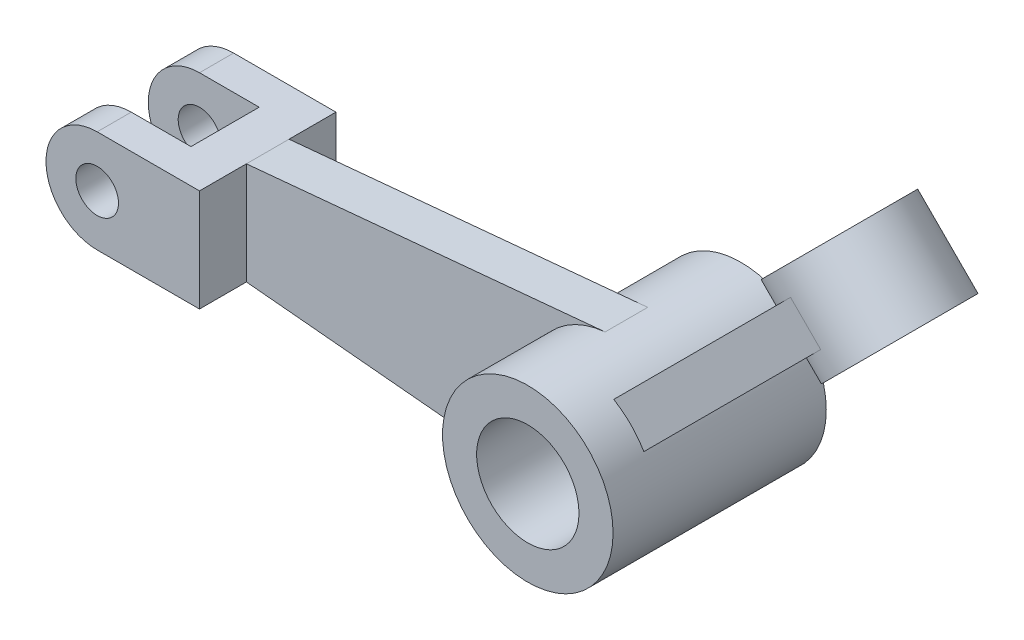
ISO-10303-21;
HEADER;
FILE_DESCRIPTION(('STEP AP214'),'2;1');
FILE_NAME('part.step','',(''),(''),'','','');
FILE_SCHEMA(('AUTOMOTIVE_DESIGN { 1 0 10303 214 1 1 1 1 }'));
ENDSEC;
DATA;
#1=APPLICATION_CONTEXT('core data for automotive mechanical design processes');
#2=APPLICATION_PROTOCOL_DEFINITION('international standard','automotive_design',2000,#1);
#3=PRODUCT_CONTEXT('',#1,'mechanical');
#4=PRODUCT('Part','Part','',(#3));
#5=PRODUCT_RELATED_PRODUCT_CATEGORY('part','',(#4));
#6=PRODUCT_DEFINITION_FORMATION('','',#4);
#7=PRODUCT_DEFINITION_CONTEXT('part definition',#1,'design');
#8=PRODUCT_DEFINITION('design','',#6,#7);
#9=PRODUCT_DEFINITION_SHAPE('','',#8);
#10=(LENGTH_UNIT() NAMED_UNIT(*) SI_UNIT(.MILLI.,.METRE.));
#11=(NAMED_UNIT(*) PLANE_ANGLE_UNIT() SI_UNIT($,.RADIAN.));
#12=(NAMED_UNIT(*) SI_UNIT($,.STERADIAN.) SOLID_ANGLE_UNIT());
#13=UNCERTAINTY_MEASURE_WITH_UNIT(LENGTH_MEASURE(1.E-05),#10,'distance_accuracy_value','');
#14=(GEOMETRIC_REPRESENTATION_CONTEXT(3) GLOBAL_UNCERTAINTY_ASSIGNED_CONTEXT((#13)) GLOBAL_UNIT_ASSIGNED_CONTEXT((#10,
#11,#12)) REPRESENTATION_CONTEXT('',''));
#15=CARTESIAN_POINT('',(0.,0.,0.));
#16=DIRECTION('',(0.,0.,1.));
#17=DIRECTION('',(1.,0.,0.));
#18=AXIS2_PLACEMENT_3D('',#15,#16,#17);
#19=CARTESIAN_POINT('',(-55.,0.,8.));
#20=DIRECTION('',(0.,0.,-1.));
#21=DIRECTION('',(-1.,0.,0.));
#22=AXIS2_PLACEMENT_3D('',#19,#20,#21);
#23=CYLINDRICAL_SURFACE('',#22,5.99999999999999);
#24=CARTESIAN_POINT('',(-55.,0.,-4.));
#25=DIRECTION('',(0.,0.,-1.));
#26=DIRECTION('',(-1.,0.,0.));
#27=AXIS2_PLACEMENT_3D('',#24,#25,#26);
#28=CIRCLE('',#27,5.99999999999999);
#29=CARTESIAN_POINT('',(-55.,-5.99999999999999,-4.));
#30=VERTEX_POINT('',#29);
#31=CARTESIAN_POINT('',(-55.,5.99999999999999,-4.));
#32=VERTEX_POINT('',#31);
#33=EDGE_CURVE('E209',#30,#32,#28,.T.);
#34=ORIENTED_EDGE('',*,*,#33,.T.);
#35=DIRECTION('',(0.,0.,-1.));
#36=VECTOR('',#35,1.);
#37=CARTESIAN_POINT('',(-55.,5.99999999999999,8.));
#38=LINE('',#37,#36);
#39=CARTESIAN_POINT('',(-55.,5.99999999999999,-8.));
#40=VERTEX_POINT('',#39);
#41=EDGE_CURVE('E251',#32,#40,#38,.T.);
#42=ORIENTED_EDGE('',*,*,#41,.T.);
#43=CARTESIAN_POINT('',(-55.,0.,-8.));
#44=DIRECTION('',(0.,0.,1.));
#45=DIRECTION('',(1.,0.,0.));
#46=AXIS2_PLACEMENT_3D('',#43,#44,#45);
#47=CIRCLE('',#46,5.99999999999999);
#48=CARTESIAN_POINT('',(-55.,-5.99999999999999,-8.));
#49=VERTEX_POINT('',#48);
#50=EDGE_CURVE('E233',#40,#49,#47,.T.);
#51=ORIENTED_EDGE('',*,*,#50,.T.);
#52=DIRECTION('',(0.,0.,-1.));
#53=VECTOR('',#52,1.);
#54=CARTESIAN_POINT('',(-55.,-5.99999999999999,8.));
#55=LINE('',#54,#53);
#56=EDGE_CURVE('E247',#30,#49,#55,.T.);
#57=ORIENTED_EDGE('',*,*,#56,.F.);
#58=EDGE_LOOP('',(#34,#42,#51,#57));
#59=FACE_BOUND('',#58,.T.);
#60=ADVANCED_FACE('F47',(#59),#23,.T.);
#61=CARTESIAN_POINT('',(-55.,0.,8.));
#62=DIRECTION('',(0.,0.,-1.));
#63=DIRECTION('',(-1.,0.,0.));
#64=AXIS2_PLACEMENT_3D('',#61,#62,#63);
#65=CYLINDRICAL_SURFACE('',#64,2.5);
#66=CARTESIAN_POINT('',(-55.,0.,-4.));
#67=DIRECTION('',(0.,0.,-1.));
#68=DIRECTION('',(-1.,0.,0.));
#69=AXIS2_PLACEMENT_3D('',#66,#67,#68);
#70=CIRCLE('',#69,2.5);
#71=CARTESIAN_POINT('',(-57.5,0.,-4.));
#72=VERTEX_POINT('',#71);
#73=EDGE_CURVE('E206',#72,#72,#70,.T.);
#74=ORIENTED_EDGE('',*,*,#73,.F.);
#75=EDGE_LOOP('',(#74));
#76=FACE_BOUND('',#75,.T.);
#77=CARTESIAN_POINT('',(-55.,0.,-8.));
#78=DIRECTION('',(0.,0.,1.));
#79=DIRECTION('',(1.,0.,0.));
#80=AXIS2_PLACEMENT_3D('',#77,#78,#79);
#81=CIRCLE('',#80,2.5);
#82=CARTESIAN_POINT('',(-52.5,0.,-8.));
#83=VERTEX_POINT('',#82);
#84=EDGE_CURVE('E211',#83,#83,#81,.T.);
#85=ORIENTED_EDGE('',*,*,#84,.F.);
#86=EDGE_LOOP('',(#85));
#87=FACE_BOUND('',#86,.T.);
#88=ADVANCED_FACE('F349',(#76,#87),#65,.F.);
#89=CARTESIAN_POINT('',(0.,0.,12.5));
#90=DIRECTION('',(0.,0.,1.));
#91=DIRECTION('',(1.,0.,0.));
#92=AXIS2_PLACEMENT_3D('',#89,#90,#91);
#93=PLANE('',#92);
#94=CARTESIAN_POINT('',(0.,0.,12.5));
#95=DIRECTION('',(0.,0.,1.));
#96=DIRECTION('',(1.,0.,0.));
#97=AXIS2_PLACEMENT_3D('',#94,#95,#96);
#98=CIRCLE('',#97,10.);
#99=CARTESIAN_POINT('',(10.,0.,12.5));
#100=VERTEX_POINT('',#99);
#101=EDGE_CURVE('E295',#100,#100,#98,.T.);
#102=ORIENTED_EDGE('',*,*,#101,.T.);
#103=EDGE_LOOP('',(#102));
#104=FACE_BOUND('',#103,.T.);
#105=CARTESIAN_POINT('',(0.,0.,12.5));
#106=DIRECTION('',(0.,0.,1.));
#107=DIRECTION('',(1.,0.,0.));
#108=AXIS2_PLACEMENT_3D('',#105,#106,#107);
#109=CIRCLE('',#108,6.);
#110=CARTESIAN_POINT('',(6.,0.,12.5));
#111=VERTEX_POINT('',#110);
#112=EDGE_CURVE('E289',#111,#111,#109,.T.);
#113=ORIENTED_EDGE('',*,*,#112,.F.);
#114=EDGE_LOOP('',(#113));
#115=FACE_BOUND('',#114,.T.);
#116=ADVANCED_FACE('F356',(#104,#115),#93,.T.);
#117=CARTESIAN_POINT('',(0.,0.,-12.5));
#118=DIRECTION('',(0.,0.,1.));
#119=DIRECTION('',(1.,0.,0.));
#120=AXIS2_PLACEMENT_3D('',#117,#118,#119);
#121=PLANE('',#120);
#122=CARTESIAN_POINT('',(0.,0.,-12.5));
#123=DIRECTION('',(0.,0.,1.));
#124=DIRECTION('',(1.,0.,0.));
#125=AXIS2_PLACEMENT_3D('',#122,#123,#124);
#126=CIRCLE('',#125,10.);
#127=CARTESIAN_POINT('',(10.,0.,-12.5));
#128=VERTEX_POINT('',#127);
#129=EDGE_CURVE('E292',#128,#128,#126,.T.);
#130=ORIENTED_EDGE('',*,*,#129,.F.);
#131=EDGE_LOOP('',(#130));
#132=FACE_BOUND('',#131,.T.);
#133=CARTESIAN_POINT('',(0.,0.,-12.5));
#134=DIRECTION('',(0.,0.,1.));
#135=DIRECTION('',(1.,0.,0.));
#136=AXIS2_PLACEMENT_3D('',#133,#134,#135);
#137=CIRCLE('',#136,6.);
#138=CARTESIAN_POINT('',(6.,0.,-12.5));
#139=VERTEX_POINT('',#138);
#140=EDGE_CURVE('E288',#139,#139,#137,.T.);
#141=ORIENTED_EDGE('',*,*,#140,.T.);
#142=EDGE_LOOP('',(#141));
#143=FACE_BOUND('',#142,.T.);
#144=ADVANCED_FACE('F427',(#132,#143),#121,.F.);
#145=CARTESIAN_POINT('',(0.,0.,12.5));
#146=DIRECTION('',(0.,0.,-1.));
#147=DIRECTION('',(-1.,0.,0.));
#148=AXIS2_PLACEMENT_3D('',#145,#146,#147);
#149=CYLINDRICAL_SURFACE('',#148,10.);
#150=CARTESIAN_POINT('',(0.,0.,7.5));
#151=DIRECTION('',(0.,0.,1.));
#152=DIRECTION('',(1.,0.,0.));
#153=AXIS2_PLACEMENT_3D('',#150,#151,#152);
#154=CIRCLE('',#153,10.);
#155=CARTESIAN_POINT('',(8.61429892178097,5.07876501584816,7.5));
#156=VERTEX_POINT('',#155);
#157=CARTESIAN_POINT('',(5.07876501584825,8.61429892178092,7.5));
#158=VERTEX_POINT('',#157);
#159=EDGE_CURVE('E65',#156,#158,#154,.T.);
#160=ORIENTED_EDGE('',*,*,#159,.T.);
#161=DIRECTION('',(0.,0.,-1.));
#162=VECTOR('',#161,1.);
#163=CARTESIAN_POINT('',(5.07876501584825,8.61429892178092,12.5));
#164=LINE('',#163,#162);
#165=CARTESIAN_POINT('',(5.07876501584825,8.61429892178092,-7.5));
#166=VERTEX_POINT('',#165);
#167=EDGE_CURVE('E13',#158,#166,#164,.T.);
#168=ORIENTED_EDGE('',*,*,#167,.T.);
#169=CARTESIAN_POINT('',(0.,0.,-7.5));
#170=DIRECTION('',(0.,0.,-1.));
#171=DIRECTION('',(-1.,0.,0.));
#172=AXIS2_PLACEMENT_3D('',#169,#170,#171);
#173=CIRCLE('',#172,10.);
#174=CARTESIAN_POINT('',(8.61429892178097,5.07876501584816,-7.5));
#175=VERTEX_POINT('',#174);
#176=EDGE_CURVE('E55',#166,#175,#173,.T.);
#177=ORIENTED_EDGE('',*,*,#176,.T.);
#178=DIRECTION('',(0.,0.,-1.));
#179=VECTOR('',#178,1.);
#180=CARTESIAN_POINT('',(8.61429892178097,5.07876501584816,12.5));
#181=LINE('',#180,#179);
#182=EDGE_CURVE('E307',#156,#175,#181,.T.);
#183=ORIENTED_EDGE('',*,*,#182,.F.);
#184=EDGE_LOOP('',(#160,#168,#177,#183));
#185=FACE_BOUND('',#184,.T.);
#186=DIRECTION('',(0.,0.,-1.));
#187=VECTOR('',#186,1.);
#188=CARTESIAN_POINT('',(-0.936363065828481,9.95606469489588,2.5));
#189=LINE('',#188,#187);
#190=CARTESIAN_POINT('',(-0.936363065828481,9.95606469489588,2.5));
#191=VERTEX_POINT('',#190);
#192=CARTESIAN_POINT('',(-0.936363065828481,9.95606469489588,-2.5));
#193=VERTEX_POINT('',#192);
#194=EDGE_CURVE('E285',#191,#193,#189,.T.);
#195=ORIENTED_EDGE('',*,*,#194,.F.);
#196=CARTESIAN_POINT('',(0.,0.,2.5));
#197=DIRECTION('',(0.,0.,1.));
#198=DIRECTION('',(1.,0.,0.));
#199=AXIS2_PLACEMENT_3D('',#196,#197,#198);
#200=CIRCLE('',#199,10.);
#201=CARTESIAN_POINT('',(-0.936363065828481,-9.95606469489588,2.5));
#202=VERTEX_POINT('',#201);
#203=EDGE_CURVE('E256',#191,#202,#200,.T.);
#204=ORIENTED_EDGE('',*,*,#203,.T.);
#205=DIRECTION('',(0.,0.,-1.));
#206=VECTOR('',#205,1.);
#207=CARTESIAN_POINT('',(-0.936363065828481,-9.95606469489588,2.5));
#208=LINE('',#207,#206);
#209=CARTESIAN_POINT('',(-0.936363065828481,-9.95606469489588,-2.5));
#210=VERTEX_POINT('',#209);
#211=EDGE_CURVE('E268',#202,#210,#208,.T.);
#212=ORIENTED_EDGE('',*,*,#211,.T.);
#213=CARTESIAN_POINT('',(0.,0.,-2.5));
#214=DIRECTION('',(0.,0.,1.));
#215=DIRECTION('',(1.,0.,0.));
#216=AXIS2_PLACEMENT_3D('',#213,#214,#215);
#217=CIRCLE('',#216,10.);
#218=EDGE_CURVE('E255',#193,#210,#217,.T.);
#219=ORIENTED_EDGE('',*,*,#218,.F.);
#220=EDGE_LOOP('',(#195,#204,#212,#219));
#221=FACE_BOUND('',#220,.T.);
#222=ORIENTED_EDGE('',*,*,#101,.F.);
#223=EDGE_LOOP('',(#222));
#224=FACE_BOUND('',#223,.T.);
#225=ORIENTED_EDGE('',*,*,#129,.T.);
#226=EDGE_LOOP('',(#225));
#227=FACE_BOUND('',#226,.T.);
#228=ADVANCED_FACE('F49',(#185,#221,#224,#227),#149,.T.);
#229=CARTESIAN_POINT('',(0.,0.,12.5));
#230=DIRECTION('',(0.,0.,-1.));
#231=DIRECTION('',(-1.,0.,0.));
#232=AXIS2_PLACEMENT_3D('',#229,#230,#231);
#233=CYLINDRICAL_SURFACE('',#232,6.);
#234=ORIENTED_EDGE('',*,*,#112,.T.);
#235=EDGE_LOOP('',(#234));
#236=FACE_BOUND('',#235,.T.);
#237=ORIENTED_EDGE('',*,*,#140,.F.);
#238=EDGE_LOOP('',(#237));
#239=FACE_BOUND('',#238,.T.);
#240=ADVANCED_FACE('F419',(#236,#239),#233,.F.);
#241=CARTESIAN_POINT('',(-0.936363065828481,9.95606469489588,2.5));
#242=DIRECTION('',(-0.0936363065828481,0.995606469489589,0.));
#243=DIRECTION('',(-0.995606469489589,-0.0936363065828481,0.));
#244=AXIS2_PLACEMENT_3D('',#241,#242,#243);
#245=PLANE('',#244);
#246=DIRECTION('',(0.995606469489589,0.0936363065828482,0.));
#247=VECTOR('',#246,1.);
#248=CARTESIAN_POINT('',(-0.936363065828481,9.95606469489588,-2.5));
#249=LINE('',#248,#247);
#250=CARTESIAN_POINT('',(-43.,6.,-2.5));
#251=VERTEX_POINT('',#250);
#252=EDGE_CURVE('E271',#251,#193,#249,.T.);
#253=ORIENTED_EDGE('',*,*,#252,.F.);
#254=DIRECTION('',(0.,0.,-1.));
#255=VECTOR('',#254,1.);
#256=CARTESIAN_POINT('',(-43.,6.,2.5));
#257=LINE('',#256,#255);
#258=CARTESIAN_POINT('',(-43.,6.,2.5));
#259=VERTEX_POINT('',#258);
#260=EDGE_CURVE('E282',#259,#251,#257,.T.);
#261=ORIENTED_EDGE('',*,*,#260,.F.);
#262=DIRECTION('',(0.995606469489589,0.0936363065828482,0.));
#263=VECTOR('',#262,1.);
#264=CARTESIAN_POINT('',(-0.936363065828481,9.95606469489588,2.5));
#265=LINE('',#264,#263);
#266=EDGE_CURVE('E258',#259,#191,#265,.T.);
#267=ORIENTED_EDGE('',*,*,#266,.T.);
#268=ORIENTED_EDGE('',*,*,#194,.T.);
#269=EDGE_LOOP('',(#253,#261,#267,#268));
#270=FACE_BOUND('',#269,.T.);
#271=ADVANCED_FACE('F395',(#270),#245,.T.);
#272=CARTESIAN_POINT('',(-0.936363065828481,-9.95606469489588,2.5));
#273=DIRECTION('',(0.0936363065828481,0.995606469489589,0.));
#274=DIRECTION('',(-0.995606469489589,0.0936363065828481,0.));
#275=AXIS2_PLACEMENT_3D('',#272,#273,#274);
#276=PLANE('',#275);
#277=DIRECTION('',(0.995606469489589,-0.0936363065828482,0.));
#278=VECTOR('',#277,1.);
#279=CARTESIAN_POINT('',(-0.936363065828481,-9.95606469489588,-2.5));
#280=LINE('',#279,#278);
#281=CARTESIAN_POINT('',(-43.,-6.,-2.5));
#282=VERTEX_POINT('',#281);
#283=EDGE_CURVE('E259',#282,#210,#280,.T.);
#284=ORIENTED_EDGE('',*,*,#283,.T.);
#285=ORIENTED_EDGE('',*,*,#211,.F.);
#286=DIRECTION('',(0.995606469489589,-0.0936363065828482,0.));
#287=VECTOR('',#286,1.);
#288=CARTESIAN_POINT('',(-0.936363065828481,-9.95606469489588,2.5));
#289=LINE('',#288,#287);
#290=CARTESIAN_POINT('',(-43.,-6.,2.5));
#291=VERTEX_POINT('',#290);
#292=EDGE_CURVE('E265',#291,#202,#289,.T.);
#293=ORIENTED_EDGE('',*,*,#292,.F.);
#294=DIRECTION('',(0.,0.,-1.));
#295=VECTOR('',#294,1.);
#296=CARTESIAN_POINT('',(-43.,-6.,2.5));
#297=LINE('',#296,#295);
#298=EDGE_CURVE('E279',#291,#282,#297,.T.);
#299=ORIENTED_EDGE('',*,*,#298,.T.);
#300=EDGE_LOOP('',(#284,#285,#293,#299));
#301=FACE_BOUND('',#300,.T.);
#302=ADVANCED_FACE('F411',(#301),#276,.F.);
#303=CARTESIAN_POINT('',(0.,0.,2.5));
#304=DIRECTION('',(0.,0.,1.));
#305=DIRECTION('',(1.,0.,0.));
#306=AXIS2_PLACEMENT_3D('',#303,#304,#305);
#307=PLANE('',#306);
#308=ORIENTED_EDGE('',*,*,#203,.F.);
#309=ORIENTED_EDGE('',*,*,#266,.F.);
#310=DIRECTION('',(0.,-1.,0.));
#311=VECTOR('',#310,1.);
#312=CARTESIAN_POINT('',(-43.,0.,2.5));
#313=LINE('',#312,#311);
#314=EDGE_CURVE('E262',#259,#291,#313,.T.);
#315=ORIENTED_EDGE('',*,*,#314,.T.);
#316=ORIENTED_EDGE('',*,*,#292,.T.);
#317=EDGE_LOOP('',(#308,#309,#315,#316));
#318=FACE_BOUND('',#317,.T.);
#319=ADVANCED_FACE('F398',(#318),#307,.T.);
#320=CARTESIAN_POINT('',(0.,0.,-2.5));
#321=DIRECTION('',(0.,0.,1.));
#322=DIRECTION('',(1.,0.,0.));
#323=AXIS2_PLACEMENT_3D('',#320,#321,#322);
#324=PLANE('',#323);
#325=ORIENTED_EDGE('',*,*,#218,.T.);
#326=ORIENTED_EDGE('',*,*,#283,.F.);
#327=DIRECTION('',(0.,-1.,0.));
#328=VECTOR('',#327,1.);
#329=CARTESIAN_POINT('',(-43.,0.,-2.5));
#330=LINE('',#329,#328);
#331=EDGE_CURVE('E274',#251,#282,#330,.T.);
#332=ORIENTED_EDGE('',*,*,#331,.F.);
#333=ORIENTED_EDGE('',*,*,#252,.T.);
#334=EDGE_LOOP('',(#325,#326,#332,#333));
#335=FACE_BOUND('',#334,.T.);
#336=ADVANCED_FACE('F403',(#335),#324,.F.);
#337=CARTESIAN_POINT('',(-43.,0.,8.));
#338=DIRECTION('',(1.,0.,0.));
#339=DIRECTION('',(0.,0.,-1.));
#340=AXIS2_PLACEMENT_3D('',#337,#338,#339);
#341=PLANE('',#340);
#342=ORIENTED_EDGE('',*,*,#314,.F.);
#343=DIRECTION('',(0.,0.,-1.));
#344=VECTOR('',#343,1.);
#345=CARTESIAN_POINT('',(-43.,6.,8.));
#346=LINE('',#345,#344);
#347=CARTESIAN_POINT('',(-43.,6.,8.));
#348=VERTEX_POINT('',#347);
#349=EDGE_CURVE('E241',#348,#259,#346,.T.);
#350=ORIENTED_EDGE('',*,*,#349,.F.);
#351=DIRECTION('',(0.,-1.,0.));
#352=VECTOR('',#351,1.);
#353=CARTESIAN_POINT('',(-43.,0.,8.));
#354=LINE('',#353,#352);
#355=CARTESIAN_POINT('',(-43.,-6.,8.));
#356=VERTEX_POINT('',#355);
#357=EDGE_CURVE('E224',#348,#356,#354,.T.);
#358=ORIENTED_EDGE('',*,*,#357,.T.);
#359=DIRECTION('',(0.,0.,-1.));
#360=VECTOR('',#359,1.);
#361=CARTESIAN_POINT('',(-43.,-6.,8.));
#362=LINE('',#361,#360);
#363=EDGE_CURVE('E245',#356,#291,#362,.T.);
#364=ORIENTED_EDGE('',*,*,#363,.T.);
#365=EDGE_LOOP('',(#342,#350,#358,#364));
#366=FACE_BOUND('',#365,.T.);
#367=ADVANCED_FACE('F371',(#366),#341,.T.);
#368=CARTESIAN_POINT('',(0.,6.00000000000001,8.));
#369=DIRECTION('',(0.,1.,0.));
#370=DIRECTION('',(-1.,0.,0.));
#371=AXIS2_PLACEMENT_3D('',#368,#369,#370);
#372=PLANE('',#371);
#373=DIRECTION('',(-1.,0.,0.));
#374=VECTOR('',#373,1.);
#375=CARTESIAN_POINT('',(-48.,6.,-4.));
#376=LINE('',#375,#374);
#377=CARTESIAN_POINT('',(-48.,6.,-4.));
#378=VERTEX_POINT('',#377);
#379=EDGE_CURVE('E193',#378,#32,#376,.T.);
#380=ORIENTED_EDGE('',*,*,#379,.F.);
#381=DIRECTION('',(0.,0.,-1.));
#382=VECTOR('',#381,1.);
#383=CARTESIAN_POINT('',(-48.,6.,-4.));
#384=LINE('',#383,#382);
#385=CARTESIAN_POINT('',(-48.,6.,4.));
#386=VERTEX_POINT('',#385);
#387=EDGE_CURVE('E190',#386,#378,#384,.T.);
#388=ORIENTED_EDGE('',*,*,#387,.F.);
#389=DIRECTION('',(1.,0.,0.));
#390=VECTOR('',#389,1.);
#391=CARTESIAN_POINT('',(-48.,6.,4.));
#392=LINE('',#391,#390);
#393=CARTESIAN_POINT('',(-55.,5.99999999999999,4.));
#394=VERTEX_POINT('',#393);
#395=EDGE_CURVE('E182',#394,#386,#392,.T.);
#396=ORIENTED_EDGE('',*,*,#395,.F.);
#397=CARTESIAN_POINT('',(-55.,5.99999999999999,8.));
#398=VERTEX_POINT('',#397);
#399=EDGE_CURVE('E252',#398,#394,#38,.T.);
#400=ORIENTED_EDGE('',*,*,#399,.F.);
#401=DIRECTION('',(1.,0.,0.));
#402=VECTOR('',#401,1.);
#403=CARTESIAN_POINT('',(0.,6.00000000000001,8.));
#404=LINE('',#403,#402);
#405=EDGE_CURVE('E215',#398,#348,#404,.T.);
#406=ORIENTED_EDGE('',*,*,#405,.T.);
#407=ORIENTED_EDGE('',*,*,#349,.T.);
#408=ORIENTED_EDGE('',*,*,#260,.T.);
#409=CARTESIAN_POINT('',(-43.,6.,-8.));
#410=VERTEX_POINT('',#409);
#411=EDGE_CURVE('E227',#251,#410,#346,.T.);
#412=ORIENTED_EDGE('',*,*,#411,.T.);
#413=DIRECTION('',(1.,0.,0.));
#414=VECTOR('',#413,1.);
#415=CARTESIAN_POINT('',(0.,6.00000000000001,-8.));
#416=LINE('',#415,#414);
#417=EDGE_CURVE('E230',#40,#410,#416,.T.);
#418=ORIENTED_EDGE('',*,*,#417,.F.);
#419=ORIENTED_EDGE('',*,*,#41,.F.);
#420=EDGE_LOOP('',(#380,#388,#396,#400,#406,#407,#408,#412,#418,#419));
#421=FACE_BOUND('',#420,.T.);
#422=ADVANCED_FACE('F364',(#421),#372,.T.);
#423=ORIENTED_EDGE('',*,*,#399,.T.);
#424=CARTESIAN_POINT('',(-55.,0.,4.));
#425=DIRECTION('',(0.,0.,1.));
#426=DIRECTION('',(1.,0.,0.));
#427=AXIS2_PLACEMENT_3D('',#424,#425,#426);
#428=CIRCLE('',#427,5.99999999999999);
#429=CARTESIAN_POINT('',(-55.,-5.99999999999999,4.));
#430=VERTEX_POINT('',#429);
#431=EDGE_CURVE('E204',#394,#430,#428,.T.);
#432=ORIENTED_EDGE('',*,*,#431,.T.);
#433=CARTESIAN_POINT('',(-55.,-5.99999999999999,8.));
#434=VERTEX_POINT('',#433);
#435=EDGE_CURVE('E248',#434,#430,#55,.T.);
#436=ORIENTED_EDGE('',*,*,#435,.F.);
#437=CARTESIAN_POINT('',(-55.,0.,8.));
#438=DIRECTION('',(0.,0.,1.));
#439=DIRECTION('',(1.,0.,0.));
#440=AXIS2_PLACEMENT_3D('',#437,#438,#439);
#441=CIRCLE('',#440,5.99999999999999);
#442=EDGE_CURVE('E219',#398,#434,#441,.T.);
#443=ORIENTED_EDGE('',*,*,#442,.F.);
#444=EDGE_LOOP('',(#423,#432,#436,#443));
#445=FACE_BOUND('',#444,.T.);
#446=ADVANCED_FACE('F352',(#445),#23,.T.);
#447=CARTESIAN_POINT('',(0.,-6.00000000000001,8.));
#448=DIRECTION('',(0.,-1.,0.));
#449=DIRECTION('',(1.,0.,0.));
#450=AXIS2_PLACEMENT_3D('',#447,#448,#449);
#451=PLANE('',#450);
#452=DIRECTION('',(1.,0.,0.));
#453=VECTOR('',#452,1.);
#454=CARTESIAN_POINT('',(0.,-6.00000000000001,-4.00000000000001));
#455=LINE('',#454,#453);
#456=CARTESIAN_POINT('',(-48.,-6.,-4.));
#457=VERTEX_POINT('',#456);
#458=EDGE_CURVE('E207',#30,#457,#455,.T.);
#459=ORIENTED_EDGE('',*,*,#458,.F.);
#460=ORIENTED_EDGE('',*,*,#56,.T.);
#461=DIRECTION('',(-1.,0.,0.));
#462=VECTOR('',#461,1.);
#463=CARTESIAN_POINT('',(0.,-6.00000000000001,-8.));
#464=LINE('',#463,#462);
#465=CARTESIAN_POINT('',(-43.,-6.,-8.));
#466=VERTEX_POINT('',#465);
#467=EDGE_CURVE('E236',#466,#49,#464,.T.);
#468=ORIENTED_EDGE('',*,*,#467,.F.);
#469=EDGE_CURVE('E244',#282,#466,#362,.T.);
#470=ORIENTED_EDGE('',*,*,#469,.F.);
#471=ORIENTED_EDGE('',*,*,#298,.F.);
#472=ORIENTED_EDGE('',*,*,#363,.F.);
#473=DIRECTION('',(-1.,0.,0.));
#474=VECTOR('',#473,1.);
#475=CARTESIAN_POINT('',(0.,-6.00000000000001,8.));
#476=LINE('',#475,#474);
#477=EDGE_CURVE('E221',#356,#434,#476,.T.);
#478=ORIENTED_EDGE('',*,*,#477,.T.);
#479=ORIENTED_EDGE('',*,*,#435,.T.);
#480=DIRECTION('',(-1.,0.,0.));
#481=VECTOR('',#480,1.);
#482=CARTESIAN_POINT('',(0.,-6.00000000000001,3.99999999999999));
#483=LINE('',#482,#481);
#484=CARTESIAN_POINT('',(-48.,-6.,4.));
#485=VERTEX_POINT('',#484);
#486=EDGE_CURVE('E201',#485,#430,#483,.T.);
#487=ORIENTED_EDGE('',*,*,#486,.F.);
#488=DIRECTION('',(0.,0.,1.));
#489=VECTOR('',#488,1.);
#490=CARTESIAN_POINT('',(-48.,-6.,8.));
#491=LINE('',#490,#489);
#492=EDGE_CURVE('E298',#457,#485,#491,.T.);
#493=ORIENTED_EDGE('',*,*,#492,.F.);
#494=EDGE_LOOP('',(#459,#460,#468,#470,#471,#472,#478,#479,#487,#493));
#495=FACE_BOUND('',#494,.T.);
#496=ADVANCED_FACE('F363',(#495),#451,.T.);
#497=CARTESIAN_POINT('',(-55.,0.,4.));
#498=DIRECTION('',(0.,0.,1.));
#499=DIRECTION('',(1.,0.,0.));
#500=AXIS2_PLACEMENT_3D('',#497,#498,#499);
#501=CIRCLE('',#500,2.5);
#502=CARTESIAN_POINT('',(-52.5,0.,4.));
#503=VERTEX_POINT('',#502);
#504=EDGE_CURVE('E199',#503,#503,#501,.T.);
#505=ORIENTED_EDGE('',*,*,#504,.F.);
#506=EDGE_LOOP('',(#505));
#507=FACE_BOUND('',#506,.T.);
#508=CARTESIAN_POINT('',(-55.,0.,8.));
#509=DIRECTION('',(0.,0.,1.));
#510=DIRECTION('',(1.,0.,0.));
#511=AXIS2_PLACEMENT_3D('',#508,#509,#510);
#512=CIRCLE('',#511,2.5);
#513=CARTESIAN_POINT('',(-52.5,0.,8.));
#514=VERTEX_POINT('',#513);
#515=EDGE_CURVE('E212',#514,#514,#512,.T.);
#516=ORIENTED_EDGE('',*,*,#515,.T.);
#517=EDGE_LOOP('',(#516));
#518=FACE_BOUND('',#517,.T.);
#519=ADVANCED_FACE('F359',(#507,#518),#65,.F.);
#520=ORIENTED_EDGE('',*,*,#411,.F.);
#521=ORIENTED_EDGE('',*,*,#331,.T.);
#522=ORIENTED_EDGE('',*,*,#469,.T.);
#523=DIRECTION('',(0.,-1.,0.));
#524=VECTOR('',#523,1.);
#525=CARTESIAN_POINT('',(-43.,0.,-8.));
#526=LINE('',#525,#524);
#527=EDGE_CURVE('E216',#410,#466,#526,.T.);
#528=ORIENTED_EDGE('',*,*,#527,.F.);
#529=EDGE_LOOP('',(#520,#521,#522,#528));
#530=FACE_BOUND('',#529,.T.);
#531=ADVANCED_FACE('F407',(#530),#341,.T.);
#532=CARTESIAN_POINT('',(0.,0.,8.));
#533=DIRECTION('',(0.,0.,1.));
#534=DIRECTION('',(1.,0.,0.));
#535=AXIS2_PLACEMENT_3D('',#532,#533,#534);
#536=PLANE('',#535);
#537=ORIENTED_EDGE('',*,*,#515,.F.);
#538=EDGE_LOOP('',(#537));
#539=FACE_BOUND('',#538,.T.);
#540=ORIENTED_EDGE('',*,*,#405,.F.);
#541=ORIENTED_EDGE('',*,*,#442,.T.);
#542=ORIENTED_EDGE('',*,*,#477,.F.);
#543=ORIENTED_EDGE('',*,*,#357,.F.);
#544=EDGE_LOOP('',(#540,#541,#542,#543));
#545=FACE_BOUND('',#544,.T.);
#546=ADVANCED_FACE('F388',(#539,#545),#536,.T.);
#547=CARTESIAN_POINT('',(0.,0.,-8.));
#548=DIRECTION('',(0.,0.,1.));
#549=DIRECTION('',(1.,0.,0.));
#550=AXIS2_PLACEMENT_3D('',#547,#548,#549);
#551=PLANE('',#550);
#552=ORIENTED_EDGE('',*,*,#84,.T.);
#553=EDGE_LOOP('',(#552));
#554=FACE_BOUND('',#553,.T.);
#555=ORIENTED_EDGE('',*,*,#417,.T.);
#556=ORIENTED_EDGE('',*,*,#527,.T.);
#557=ORIENTED_EDGE('',*,*,#467,.T.);
#558=ORIENTED_EDGE('',*,*,#50,.F.);
#559=EDGE_LOOP('',(#555,#556,#557,#558));
#560=FACE_BOUND('',#559,.T.);
#561=ADVANCED_FACE('F495',(#554,#560),#551,.F.);
#562=CARTESIAN_POINT('',(-48.,-10.,-4.));
#563=DIRECTION('',(0.,0.,-1.));
#564=DIRECTION('',(-1.,0.,0.));
#565=AXIS2_PLACEMENT_3D('',#562,#563,#564);
#566=PLANE('',#565);
#567=ORIENTED_EDGE('',*,*,#73,.T.);
#568=EDGE_LOOP('',(#567));
#569=FACE_BOUND('',#568,.T.);
#570=ORIENTED_EDGE('',*,*,#33,.F.);
#571=ORIENTED_EDGE('',*,*,#458,.T.);
#572=DIRECTION('',(0.,1.,0.));
#573=VECTOR('',#572,1.);
#574=CARTESIAN_POINT('',(-48.,-10.,-4.));
#575=LINE('',#574,#573);
#576=EDGE_CURVE('E197',#457,#378,#575,.T.);
#577=ORIENTED_EDGE('',*,*,#576,.T.);
#578=ORIENTED_EDGE('',*,*,#379,.T.);
#579=EDGE_LOOP('',(#570,#571,#577,#578));
#580=FACE_BOUND('',#579,.T.);
#581=ADVANCED_FACE('F504',(#569,#580),#566,.F.);
#582=CARTESIAN_POINT('',(-48.,-10.,4.));
#583=DIRECTION('',(0.,0.,1.));
#584=DIRECTION('',(1.,0.,0.));
#585=AXIS2_PLACEMENT_3D('',#582,#583,#584);
#586=PLANE('',#585);
#587=ORIENTED_EDGE('',*,*,#504,.T.);
#588=EDGE_LOOP('',(#587));
#589=FACE_BOUND('',#588,.T.);
#590=ORIENTED_EDGE('',*,*,#395,.T.);
#591=DIRECTION('',(0.,1.,0.));
#592=VECTOR('',#591,1.);
#593=CARTESIAN_POINT('',(-48.,-10.,4.));
#594=LINE('',#593,#592);
#595=EDGE_CURVE('E196',#485,#386,#594,.T.);
#596=ORIENTED_EDGE('',*,*,#595,.F.);
#597=ORIENTED_EDGE('',*,*,#486,.T.);
#598=ORIENTED_EDGE('',*,*,#431,.F.);
#599=EDGE_LOOP('',(#590,#596,#597,#598));
#600=FACE_BOUND('',#599,.T.);
#601=ADVANCED_FACE('F381',(#589,#600),#586,.F.);
#602=CARTESIAN_POINT('',(-48.,-10.,-4.));
#603=DIRECTION('',(1.,0.,0.));
#604=DIRECTION('',(0.,1.,0.));
#605=AXIS2_PLACEMENT_3D('',#602,#603,#604);
#606=PLANE('',#605);
#607=ORIENTED_EDGE('',*,*,#492,.T.);
#608=ORIENTED_EDGE('',*,*,#595,.T.);
#609=ORIENTED_EDGE('',*,*,#387,.T.);
#610=ORIENTED_EDGE('',*,*,#576,.F.);
#611=EDGE_LOOP('',(#607,#608,#609,#610));
#612=FACE_BOUND('',#611,.T.);
#613=ADVANCED_FACE('F554',(#612),#606,.F.);
#614=CARTESIAN_POINT('',(-1.76776695296636,1.76776695296638,0.));
#615=DIRECTION('',(-0.707106781186544,0.707106781186551,0.));
#616=DIRECTION('',(-0.707106781186551,-0.707106781186544,0.));
#617=AXIS2_PLACEMENT_3D('',#614,#615,#616);
#618=PLANE('',#617);
#619=ORIENTED_EDGE('',*,*,#167,.F.);
#620=DIRECTION('',(-0.707106781186551,-0.707106781186544,0.));
#621=VECTOR('',#620,1.);
#622=CARTESIAN_POINT('',(-1.76776695296636,1.76776695296638,7.5));
#623=LINE('',#622,#621);
#624=CARTESIAN_POINT('',(25.8093975133091,29.3449314192416,7.5));
#625=VERTEX_POINT('',#624);
#626=EDGE_CURVE('E180',#625,#158,#623,.T.);
#627=ORIENTED_EDGE('',*,*,#626,.F.);
#628=CARTESIAN_POINT('',(25.8093975133091,29.3449314192416,0.));
#629=DIRECTION('',(-0.707106781186544,0.707106781186551,0.));
#630=DIRECTION('',(-0.707106781186551,-0.707106781186544,0.));
#631=AXIS2_PLACEMENT_3D('',#628,#629,#630);
#632=CIRCLE('',#631,7.5);
#633=CARTESIAN_POINT('',(25.8093975133091,29.3449314192416,-7.5));
#634=VERTEX_POINT('',#633);
#635=EDGE_CURVE('E164',#634,#625,#632,.T.);
#636=ORIENTED_EDGE('',*,*,#635,.F.);
#637=DIRECTION('',(0.707106781186551,0.707106781186544,0.));
#638=VECTOR('',#637,1.);
#639=CARTESIAN_POINT('',(-1.76776695296636,1.76776695296638,-7.5));
#640=LINE('',#639,#638);
#641=EDGE_CURVE('E184',#166,#634,#640,.T.);
#642=ORIENTED_EDGE('',*,*,#641,.F.);
#643=EDGE_LOOP('',(#619,#627,#636,#642));
#644=FACE_BOUND('',#643,.T.);
#645=ADVANCED_FACE('F563',(#644),#618,.T.);
#646=CARTESIAN_POINT('',(1.76776695296636,-1.76776695296638,0.));
#647=DIRECTION('',(-0.707106781186544,0.707106781186551,0.));
#648=DIRECTION('',(-0.707106781186551,-0.707106781186544,0.));
#649=AXIS2_PLACEMENT_3D('',#646,#647,#648);
#650=PLANE('',#649);
#651=DIRECTION('',(-0.707106781186551,-0.707106781186544,0.));
#652=VECTOR('',#651,1.);
#653=CARTESIAN_POINT('',(1.76776695296636,-1.76776695296638,7.5));
#654=LINE('',#653,#652);
#655=CARTESIAN_POINT('',(29.3449314192419,25.8093975133088,7.5));
#656=VERTEX_POINT('',#655);
#657=EDGE_CURVE('E155',#656,#156,#654,.T.);
#658=ORIENTED_EDGE('',*,*,#657,.T.);
#659=ORIENTED_EDGE('',*,*,#182,.T.);
#660=DIRECTION('',(0.707106781186551,0.707106781186544,0.));
#661=VECTOR('',#660,1.);
#662=CARTESIAN_POINT('',(1.76776695296636,-1.76776695296638,-7.5));
#663=LINE('',#662,#661);
#664=CARTESIAN_POINT('',(29.3449314192419,25.8093975133088,-7.5));
#665=VERTEX_POINT('',#664);
#666=EDGE_CURVE('E165',#175,#665,#663,.T.);
#667=ORIENTED_EDGE('',*,*,#666,.T.);
#668=CARTESIAN_POINT('',(29.3449314192419,25.8093975133088,0.));
#669=DIRECTION('',(-0.707106781186544,0.707106781186551,0.));
#670=DIRECTION('',(-0.707106781186551,-0.707106781186544,0.));
#671=AXIS2_PLACEMENT_3D('',#668,#669,#670);
#672=CIRCLE('',#671,7.5);
#673=EDGE_CURVE('E168',#665,#656,#672,.T.);
#674=ORIENTED_EDGE('',*,*,#673,.T.);
#675=EDGE_LOOP('',(#658,#659,#667,#674));
#676=FACE_BOUND('',#675,.T.);
#677=ADVANCED_FACE('F169',(#676),#650,.F.);
#678=CARTESIAN_POINT('',(-1.76776695296636,1.76776695296638,-7.5));
#679=DIRECTION('',(0.,0.,-1.));
#680=DIRECTION('',(-1.,0.,0.));
#681=AXIS2_PLACEMENT_3D('',#678,#679,#680);
#682=PLANE('',#681);
#683=ORIENTED_EDGE('',*,*,#176,.F.);
#684=ORIENTED_EDGE('',*,*,#641,.T.);
#685=DIRECTION('',(0.707106781186544,-0.707106781186551,0.));
#686=VECTOR('',#685,1.);
#687=CARTESIAN_POINT('',(25.8093975133091,29.3449314192416,-7.5));
#688=LINE('',#687,#686);
#689=EDGE_CURVE('E179',#634,#665,#688,.T.);
#690=ORIENTED_EDGE('',*,*,#689,.T.);
#691=ORIENTED_EDGE('',*,*,#666,.F.);
#692=EDGE_LOOP('',(#683,#684,#690,#691));
#693=FACE_BOUND('',#692,.T.);
#694=ADVANCED_FACE('F312',(#693),#682,.T.);
#695=CARTESIAN_POINT('',(-1.76776695296636,1.76776695296638,7.5));
#696=DIRECTION('',(0.,0.,1.));
#697=DIRECTION('',(1.,0.,0.));
#698=AXIS2_PLACEMENT_3D('',#695,#696,#697);
#699=PLANE('',#698);
#700=ORIENTED_EDGE('',*,*,#159,.F.);
#701=ORIENTED_EDGE('',*,*,#657,.F.);
#702=DIRECTION('',(0.707106781186544,-0.707106781186551,0.));
#703=VECTOR('',#702,1.);
#704=CARTESIAN_POINT('',(25.8093975133091,29.3449314192416,7.5));
#705=LINE('',#704,#703);
#706=EDGE_CURVE('E160',#625,#656,#705,.T.);
#707=ORIENTED_EDGE('',*,*,#706,.F.);
#708=ORIENTED_EDGE('',*,*,#626,.T.);
#709=EDGE_LOOP('',(#700,#701,#707,#708));
#710=FACE_BOUND('',#709,.T.);
#711=ADVANCED_FACE('F157',(#710),#699,.T.);
#712=CARTESIAN_POINT('',(24.0416305603428,31.112698372208,0.));
#713=DIRECTION('',(0.707106781186544,-0.707106781186551,0.));
#714=DIRECTION('',(0.707106781186551,0.707106781186544,0.));
#715=AXIS2_PLACEMENT_3D('',#712,#713,#714);
#716=CYLINDRICAL_SURFACE('',#715,7.5);
#717=CARTESIAN_POINT('',(24.0416305603428,31.112698372208,0.));
#718=DIRECTION('',(-0.707106781186544,0.707106781186551,0.));
#719=DIRECTION('',(-0.707106781186551,-0.707106781186544,0.));
#720=AXIS2_PLACEMENT_3D('',#717,#718,#719);
#721=CIRCLE('',#720,7.5);
#722=CARTESIAN_POINT('',(18.7383297014436,25.8093975133089,0.));
#723=VERTEX_POINT('',#722);
#724=EDGE_CURVE('E174',#723,#723,#721,.T.);
#725=ORIENTED_EDGE('',*,*,#724,.F.);
#726=EDGE_LOOP('',(#725));
#727=FACE_BOUND('',#726,.T.);
#728=CARTESIAN_POINT('',(31.1126983722082,24.0416305603425,0.));
#729=DIRECTION('',(-0.707106781186544,0.707106781186551,0.));
#730=DIRECTION('',(-0.707106781186551,-0.707106781186544,0.));
#731=AXIS2_PLACEMENT_3D('',#728,#729,#730);
#732=CIRCLE('',#731,7.5);
#733=CARTESIAN_POINT('',(25.8093975133091,18.7383297014434,0.));
#734=VERTEX_POINT('',#733);
#735=EDGE_CURVE('E316',#734,#734,#732,.T.);
#736=ORIENTED_EDGE('',*,*,#735,.T.);
#737=EDGE_LOOP('',(#736));
#738=FACE_BOUND('',#737,.T.);
#739=ORIENTED_EDGE('',*,*,#673,.F.);
#740=ORIENTED_EDGE('',*,*,#689,.F.);
#741=ORIENTED_EDGE('',*,*,#635,.T.);
#742=ORIENTED_EDGE('',*,*,#706,.T.);
#743=EDGE_LOOP('',(#739,#740,#741,#742));
#744=FACE_BOUND('',#743,.T.);
#745=ADVANCED_FACE('F177',(#727,#738,#744),#716,.T.);
#746=CARTESIAN_POINT('',(24.0416305603428,31.112698372208,0.));
#747=DIRECTION('',(0.707106781186544,-0.707106781186551,0.));
#748=DIRECTION('',(0.707106781186551,0.707106781186544,0.));
#749=AXIS2_PLACEMENT_3D('',#746,#747,#748);
#750=CYLINDRICAL_SURFACE('',#749,4.);
#751=CARTESIAN_POINT('',(24.0416305603428,31.112698372208,0.));
#752=DIRECTION('',(-0.707106781186544,0.707106781186551,0.));
#753=DIRECTION('',(-0.707106781186551,-0.707106781186544,0.));
#754=AXIS2_PLACEMENT_3D('',#751,#752,#753);
#755=CIRCLE('',#754,4.);
#756=CARTESIAN_POINT('',(21.2132034355966,28.2842712474618,0.));
#757=VERTEX_POINT('',#756);
#758=EDGE_CURVE('E319',#757,#757,#755,.T.);
#759=ORIENTED_EDGE('',*,*,#758,.T.);
#760=EDGE_LOOP('',(#759));
#761=FACE_BOUND('',#760,.T.);
#762=CARTESIAN_POINT('',(31.1126983722082,24.0416305603425,0.));
#763=DIRECTION('',(-0.707106781186544,0.707106781186551,0.));
#764=DIRECTION('',(-0.707106781186551,-0.707106781186544,0.));
#765=AXIS2_PLACEMENT_3D('',#762,#763,#764);
#766=CIRCLE('',#765,4.);
#767=CARTESIAN_POINT('',(28.284271247462,21.2132034355963,0.));
#768=VERTEX_POINT('',#767);
#769=EDGE_CURVE('E320',#768,#768,#766,.T.);
#770=ORIENTED_EDGE('',*,*,#769,.F.);
#771=EDGE_LOOP('',(#770));
#772=FACE_BOUND('',#771,.T.);
#773=ADVANCED_FACE('F328',(#761,#772),#750,.F.);
#774=CARTESIAN_POINT('',(-3.53553390593272,3.53553390593275,0.));
#775=DIRECTION('',(-0.707106781186544,0.707106781186551,0.));
#776=DIRECTION('',(-0.707106781186551,-0.707106781186544,0.));
#777=AXIS2_PLACEMENT_3D('',#774,#775,#776);
#778=PLANE('',#777);
#779=ORIENTED_EDGE('',*,*,#758,.F.);
#780=EDGE_LOOP('',(#779));
#781=FACE_BOUND('',#780,.T.);
#782=ORIENTED_EDGE('',*,*,#724,.T.);
#783=EDGE_LOOP('',(#782));
#784=FACE_BOUND('',#783,.T.);
#785=ADVANCED_FACE('F331',(#781,#784),#778,.T.);
#786=CARTESIAN_POINT('',(3.53553390593272,-3.53553390593276,0.));
#787=DIRECTION('',(-0.707106781186544,0.707106781186551,0.));
#788=DIRECTION('',(-0.707106781186551,-0.707106781186544,0.));
#789=AXIS2_PLACEMENT_3D('',#786,#787,#788);
#790=PLANE('',#789);
#791=ORIENTED_EDGE('',*,*,#769,.T.);
#792=EDGE_LOOP('',(#791));
#793=FACE_BOUND('',#792,.T.);
#794=ORIENTED_EDGE('',*,*,#735,.F.);
#795=EDGE_LOOP('',(#794));
#796=FACE_BOUND('',#795,.T.);
#797=ADVANCED_FACE('F334',(#793,#796),#790,.F.);
#798=CLOSED_SHELL('',(#60,#88,#116,#144,#228,#240,#271,#302,#319,#336,#367,#422,#446,#496,#519,
#531,#546,#561,#581,#601,#613,#645,#677,#694,#711,#745,#773,#785,#797));
#799=MANIFOLD_SOLID_BREP('B2',#798);
#800=ADVANCED_BREP_SHAPE_REPRESENTATION('',(#18,#799),#14);
#801=SHAPE_DEFINITION_REPRESENTATION(#9,#800);
ENDSEC;
END-ISO-10303-21;
